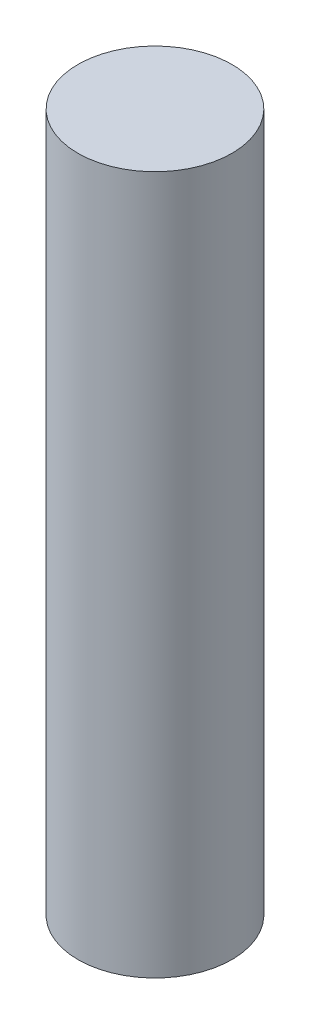
ISO-10303-21;
HEADER;
FILE_DESCRIPTION(('STEP AP214'),'2;1');
FILE_NAME('part.step','',(''),(''),'','','');
FILE_SCHEMA(('AUTOMOTIVE_DESIGN { 1 0 10303 214 1 1 1 1 }'));
ENDSEC;
DATA;
#1=APPLICATION_CONTEXT('core data for automotive mechanical design processes');
#2=APPLICATION_PROTOCOL_DEFINITION('international standard','automotive_design',2000,#1);
#3=PRODUCT_CONTEXT('',#1,'mechanical');
#4=PRODUCT('Part','Part','',(#3));
#5=PRODUCT_RELATED_PRODUCT_CATEGORY('part','',(#4));
#6=PRODUCT_DEFINITION_FORMATION('','',#4);
#7=PRODUCT_DEFINITION_CONTEXT('part definition',#1,'design');
#8=PRODUCT_DEFINITION('design','',#6,#7);
#9=PRODUCT_DEFINITION_SHAPE('','',#8);
#10=(LENGTH_UNIT() NAMED_UNIT(*) SI_UNIT(.MILLI.,.METRE.));
#11=(NAMED_UNIT(*) PLANE_ANGLE_UNIT() SI_UNIT($,.RADIAN.));
#12=(NAMED_UNIT(*) SI_UNIT($,.STERADIAN.) SOLID_ANGLE_UNIT());
#13=UNCERTAINTY_MEASURE_WITH_UNIT(LENGTH_MEASURE(1.E-05),#10,'distance_accuracy_value','');
#14=(GEOMETRIC_REPRESENTATION_CONTEXT(3) GLOBAL_UNCERTAINTY_ASSIGNED_CONTEXT((#13)) GLOBAL_UNIT_ASSIGNED_CONTEXT((#10,
#11,#12)) REPRESENTATION_CONTEXT('',''));
#15=CARTESIAN_POINT('',(0.,0.,0.));
#16=DIRECTION('',(0.,0.,1.));
#17=DIRECTION('',(1.,0.,0.));
#18=AXIS2_PLACEMENT_3D('',#15,#16,#17);
#19=CARTESIAN_POINT('',(0.,7.36233801583519,-4.575));
#20=DIRECTION('',(0.,-1.,0.));
#21=DIRECTION('',(0.,0.,-1.));
#22=AXIS2_PLACEMENT_3D('',#19,#20,#21);
#23=CYLINDRICAL_SURFACE('',#22,1.);
#24=CARTESIAN_POINT('',(0.,-4.533910891089,-4.575));
#25=DIRECTION('',(0.,1.,0.));
#26=DIRECTION('',(0.,0.,1.));
#27=AXIS2_PLACEMENT_3D('',#24,#25,#26);
#28=CIRCLE('',#27,1.);
#29=CARTESIAN_POINT('',(0.,-4.533910891089,-3.575));
#30=VERTEX_POINT('',#29);
#31=EDGE_CURVE('E48',#30,#30,#28,.T.);
#32=ORIENTED_EDGE('',*,*,#31,.T.);
#33=EDGE_LOOP('',(#32));
#34=FACE_BOUND('',#33,.T.);
#35=CARTESIAN_POINT('',(0.,4.533910891089,-4.575));
#36=DIRECTION('',(0.,1.,0.));
#37=DIRECTION('',(0.,0.,1.));
#38=AXIS2_PLACEMENT_3D('',#35,#36,#37);
#39=CIRCLE('',#38,1.);
#40=CARTESIAN_POINT('',(0.,4.533910891089,-3.575));
#41=VERTEX_POINT('',#40);
#42=EDGE_CURVE('E10',#41,#41,#39,.T.);
#43=ORIENTED_EDGE('',*,*,#42,.F.);
#44=EDGE_LOOP('',(#43));
#45=FACE_BOUND('',#44,.T.);
#46=ADVANCED_FACE('F41',(#34,#45),#23,.T.);
#47=CARTESIAN_POINT('',(0.,-4.533910891089,0.));
#48=DIRECTION('',(0.,1.,0.));
#49=DIRECTION('',(0.,0.,1.));
#50=AXIS2_PLACEMENT_3D('',#47,#48,#49);
#51=PLANE('',#50);
#52=ORIENTED_EDGE('',*,*,#31,.F.);
#53=EDGE_LOOP('',(#52));
#54=FACE_BOUND('',#53,.T.);
#55=ADVANCED_FACE('F57',(#54),#51,.F.);
#56=CARTESIAN_POINT('',(-1.917425742574,4.533910891089,-1.));
#57=DIRECTION('',(0.,1.,0.));
#58=DIRECTION('',(1.,0.,0.));
#59=AXIS2_PLACEMENT_3D('',#56,#57,#58);
#60=PLANE('',#59);
#61=ORIENTED_EDGE('',*,*,#42,.T.);
#62=EDGE_LOOP('',(#61));
#63=FACE_BOUND('',#62,.T.);
#64=ADVANCED_FACE('F43',(#63),#60,.T.);
#65=CLOSED_SHELL('',(#46,#55,#64));
#66=MANIFOLD_SOLID_BREP('B2',#65);
#67=ADVANCED_BREP_SHAPE_REPRESENTATION('',(#18,#66),#14);
#68=SHAPE_DEFINITION_REPRESENTATION(#9,#67);
ENDSEC;
END-ISO-10303-21;
